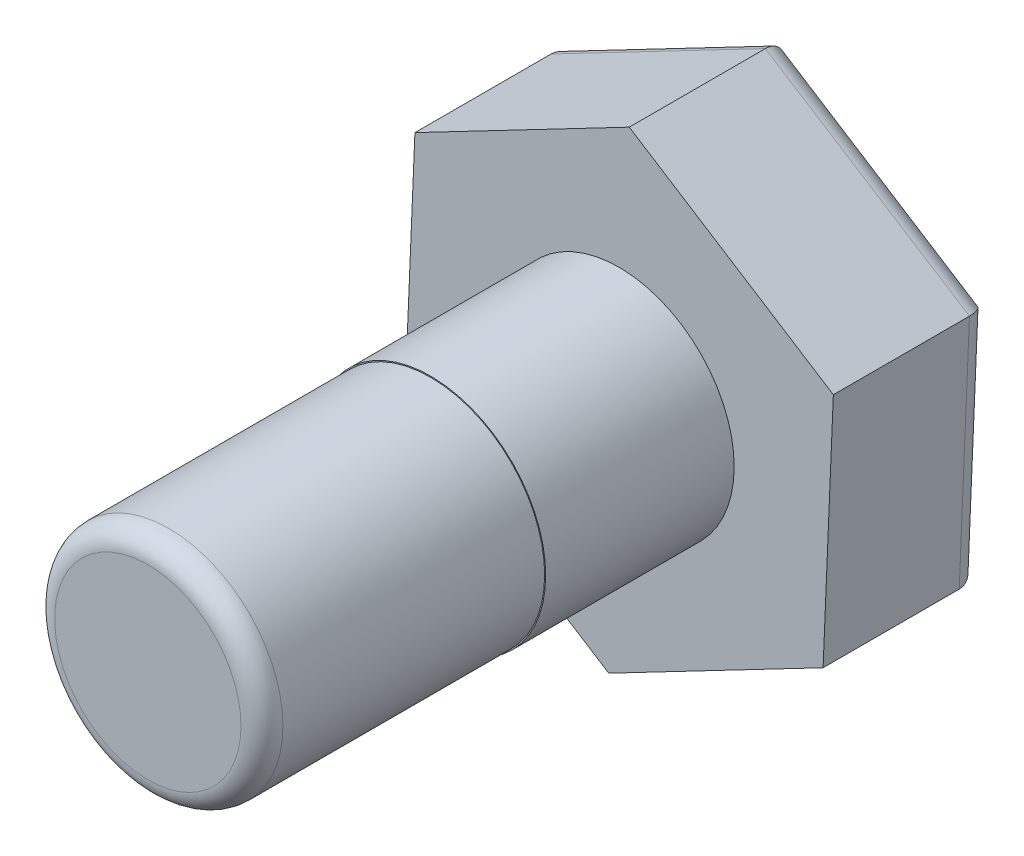
ISO-10303-21;
HEADER;
FILE_DESCRIPTION(('STEP AP214'),'2;1');
FILE_NAME('part.step','',(''),(''),'','','');
FILE_SCHEMA(('AUTOMOTIVE_DESIGN { 1 0 10303 214 1 1 1 1 }'));
ENDSEC;
DATA;
#1=APPLICATION_CONTEXT('core data for automotive mechanical design processes');
#2=APPLICATION_PROTOCOL_DEFINITION('international standard','automotive_design',2000,#1);
#3=PRODUCT_CONTEXT('',#1,'mechanical');
#4=PRODUCT('Part','Part','',(#3));
#5=PRODUCT_RELATED_PRODUCT_CATEGORY('part','',(#4));
#6=PRODUCT_DEFINITION_FORMATION('','',#4);
#7=PRODUCT_DEFINITION_CONTEXT('part definition',#1,'design');
#8=PRODUCT_DEFINITION('design','',#6,#7);
#9=PRODUCT_DEFINITION_SHAPE('','',#8);
#10=(LENGTH_UNIT() NAMED_UNIT(*) SI_UNIT(.MILLI.,.METRE.));
#11=(NAMED_UNIT(*) PLANE_ANGLE_UNIT() SI_UNIT($,.RADIAN.));
#12=(NAMED_UNIT(*) SI_UNIT($,.STERADIAN.) SOLID_ANGLE_UNIT());
#13=UNCERTAINTY_MEASURE_WITH_UNIT(LENGTH_MEASURE(1.E-05),#10,'distance_accuracy_value','');
#14=(GEOMETRIC_REPRESENTATION_CONTEXT(3) GLOBAL_UNCERTAINTY_ASSIGNED_CONTEXT((#13)) GLOBAL_UNIT_ASSIGNED_CONTEXT((#10,
#11,#12)) REPRESENTATION_CONTEXT('',''));
#15=CARTESIAN_POINT('',(0.,0.,0.));
#16=DIRECTION('',(0.,0.,1.));
#17=DIRECTION('',(1.,0.,0.));
#18=AXIS2_PLACEMENT_3D('',#15,#16,#17);
#19=CARTESIAN_POINT('',(0.,0.,33.));
#20=DIRECTION('',(0.,0.,1.));
#21=DIRECTION('',(1.,0.,0.));
#22=AXIS2_PLACEMENT_3D('',#19,#20,#21);
#23=PLANE('',#22);
#24=CARTESIAN_POINT('',(0.,0.,33.));
#25=DIRECTION('',(0.,0.,1.));
#26=DIRECTION('',(1.,0.,0.));
#27=AXIS2_PLACEMENT_3D('',#24,#25,#26);
#28=CIRCLE('',#27,11.);
#29=CARTESIAN_POINT('',(11.,0.,33.));
#30=VERTEX_POINT('',#29);
#31=EDGE_CURVE('E125',#30,#30,#28,.T.);
#32=ORIENTED_EDGE('',*,*,#31,.T.);
#33=EDGE_LOOP('',(#32));
#34=FACE_BOUND('',#33,.T.);
#35=CARTESIAN_POINT('',(0.,0.,33.));
#36=DIRECTION('',(0.,0.,1.));
#37=DIRECTION('',(1.,0.,0.));
#38=AXIS2_PLACEMENT_3D('',#35,#36,#37);
#39=CIRCLE('',#38,10.9);
#40=CARTESIAN_POINT('',(10.9,0.,33.));
#41=VERTEX_POINT('',#40);
#42=EDGE_CURVE('E160',#41,#41,#39,.T.);
#43=ORIENTED_EDGE('',*,*,#42,.F.);
#44=EDGE_LOOP('',(#43));
#45=FACE_BOUND('',#44,.T.);
#46=ADVANCED_FACE('F31',(#34,#45),#23,.T.);
#47=CARTESIAN_POINT('',(21.4532721099387,33.7602890357432,15.));
#48=DIRECTION('',(0.,0.,1.));
#49=DIRECTION('',(1.,0.,0.));
#50=AXIS2_PLACEMENT_3D('',#47,#48,#49);
#51=PLANE('',#50);
#52=DIRECTION('',(0.0424733530908878,0.999097599975707,0.));
#53=VECTOR('',#52,1.);
#54=CARTESIAN_POINT('',(19.4915119627059,-12.3860524276714,15.));
#55=LINE('',#54,#53);
#56=CARTESIAN_POINT('',(19.4915119627059,-12.3860524276714,15.));
#57=VERTEX_POINT('',#56);
#58=CARTESIAN_POINT('',(20.4723920363223,10.6871183040359,15.));
#59=VERTEX_POINT('',#58);
#60=EDGE_CURVE('E117',#57,#59,#55,.T.);
#61=ORIENTED_EDGE('',*,*,#60,.T.);
#62=DIRECTION('',(-0.844007225893581,0.536331802748468,0.));
#63=VECTOR('',#62,1.);
#64=CARTESIAN_POINT('',(20.4723920363223,10.6871183040359,15.));
#65=LINE('',#64,#63);
#66=CARTESIAN_POINT('',(0.980880073616411,23.0731707317073,15.));
#67=VERTEX_POINT('',#66);
#68=EDGE_CURVE('E105',#59,#67,#65,.T.);
#69=ORIENTED_EDGE('',*,*,#68,.T.);
#70=DIRECTION('',(-0.886480578984469,-0.462765797227238,0.));
#71=VECTOR('',#70,1.);
#72=CARTESIAN_POINT('',(0.980880073616411,23.0731707317073,15.));
#73=LINE('',#72,#71);
#74=CARTESIAN_POINT('',(-19.4915119627059,12.3860524276714,15.));
#75=VERTEX_POINT('',#74);
#76=EDGE_CURVE('E116',#67,#75,#73,.T.);
#77=ORIENTED_EDGE('',*,*,#76,.T.);
#78=DIRECTION('',(-0.0424733530908877,-0.999097599975707,0.));
#79=VECTOR('',#78,1.);
#80=CARTESIAN_POINT('',(-19.4915119627059,12.3860524276714,15.));
#81=LINE('',#80,#79);
#82=CARTESIAN_POINT('',(-20.4723920363223,-10.6871183040359,15.));
#83=VERTEX_POINT('',#82);
#84=EDGE_CURVE('E265',#75,#83,#81,.T.);
#85=ORIENTED_EDGE('',*,*,#84,.T.);
#86=DIRECTION('',(0.844007225893581,-0.536331802748469,0.));
#87=VECTOR('',#86,1.);
#88=CARTESIAN_POINT('',(-20.4723920363223,-10.6871183040359,15.));
#89=LINE('',#88,#87);
#90=CARTESIAN_POINT('',(-0.980880073616402,-23.0731707317073,15.));
#91=VERTEX_POINT('',#90);
#92=EDGE_CURVE('E267',#83,#91,#89,.T.);
#93=ORIENTED_EDGE('',*,*,#92,.T.);
#94=DIRECTION('',(0.886480578984469,0.462765797227238,0.));
#95=VECTOR('',#94,1.);
#96=CARTESIAN_POINT('',(-0.980880073616402,-23.0731707317073,15.));
#97=LINE('',#96,#95);
#98=EDGE_CURVE('E123',#91,#57,#97,.T.);
#99=ORIENTED_EDGE('',*,*,#98,.T.);
#100=EDGE_LOOP('',(#61,#69,#77,#85,#93,#99));
#101=FACE_BOUND('',#100,.T.);
#102=CARTESIAN_POINT('',(0.,0.,15.));
#103=DIRECTION('',(0.,0.,1.));
#104=DIRECTION('',(1.,0.,0.));
#105=AXIS2_PLACEMENT_3D('',#102,#103,#104);
#106=CIRCLE('',#105,11.);
#107=CARTESIAN_POINT('',(11.,0.,15.));
#108=VERTEX_POINT('',#107);
#109=EDGE_CURVE('E173',#108,#108,#106,.T.);
#110=ORIENTED_EDGE('',*,*,#109,.F.);
#111=EDGE_LOOP('',(#110));
#112=FACE_BOUND('',#111,.T.);
#113=ADVANCED_FACE('F120',(#101,#112),#51,.T.);
#114=CARTESIAN_POINT('',(19.4915119627059,-12.3860524276714,15.));
#115=DIRECTION('',(-0.999097599975706,0.0424733530908878,0.));
#116=DIRECTION('',(-0.0424733530908878,-0.999097599975706,0.));
#117=AXIS2_PLACEMENT_3D('',#114,#115,#116);
#118=PLANE('',#117);
#119=DIRECTION('',(0.,0.,-1.));
#120=VECTOR('',#119,1.);
#121=CARTESIAN_POINT('',(19.4915119627059,-12.3860524276714,15.));
#122=LINE('',#121,#120);
#123=CARTESIAN_POINT('',(19.4915119627059,-12.3860524276714,2.));
#124=VERTEX_POINT('',#123);
#125=EDGE_CURVE('E272',#57,#124,#122,.T.);
#126=ORIENTED_EDGE('',*,*,#125,.T.);
#127=DIRECTION('',(0.0424733530908878,0.999097599975706,0.));
#128=VECTOR('',#127,1.);
#129=CARTESIAN_POINT('',(19.4915119627059,-12.3860524276714,2.));
#130=LINE('',#129,#128);
#131=CARTESIAN_POINT('',(20.4723920363223,10.6871183040359,2.));
#132=VERTEX_POINT('',#131);
#133=EDGE_CURVE('E129',#124,#132,#130,.T.);
#134=ORIENTED_EDGE('',*,*,#133,.T.);
#135=DIRECTION('',(0.,0.,-1.));
#136=VECTOR('',#135,1.);
#137=CARTESIAN_POINT('',(20.4723920363223,10.6871183040359,15.));
#138=LINE('',#137,#136);
#139=EDGE_CURVE('E110',#59,#132,#138,.T.);
#140=ORIENTED_EDGE('',*,*,#139,.F.);
#141=ORIENTED_EDGE('',*,*,#60,.F.);
#142=EDGE_LOOP('',(#126,#134,#140,#141));
#143=FACE_BOUND('',#142,.T.);
#144=ADVANCED_FACE('F127',(#143),#118,.F.);
#145=CARTESIAN_POINT('',(20.4723920363223,10.6871183040359,15.));
#146=DIRECTION('',(-0.536331802748468,-0.844007225893581,0.));
#147=DIRECTION('',(0.844007225893581,-0.536331802748468,0.));
#148=AXIS2_PLACEMENT_3D('',#145,#146,#147);
#149=PLANE('',#148);
#150=ORIENTED_EDGE('',*,*,#139,.T.);
#151=DIRECTION('',(-0.844007225893581,0.536331802748468,0.));
#152=VECTOR('',#151,1.);
#153=CARTESIAN_POINT('',(20.4723920363223,10.6871183040359,2.));
#154=LINE('',#153,#152);
#155=CARTESIAN_POINT('',(0.980880073616411,23.0731707317073,2.));
#156=VERTEX_POINT('',#155);
#157=EDGE_CURVE('E130',#132,#156,#154,.T.);
#158=ORIENTED_EDGE('',*,*,#157,.T.);
#159=DIRECTION('',(0.,0.,-1.));
#160=VECTOR('',#159,1.);
#161=CARTESIAN_POINT('',(0.980880073616411,23.0731707317073,15.));
#162=LINE('',#161,#160);
#163=EDGE_CURVE('E113',#67,#156,#162,.T.);
#164=ORIENTED_EDGE('',*,*,#163,.F.);
#165=ORIENTED_EDGE('',*,*,#68,.F.);
#166=EDGE_LOOP('',(#150,#158,#164,#165));
#167=FACE_BOUND('',#166,.T.);
#168=ADVANCED_FACE('F107',(#167),#149,.F.);
#169=CARTESIAN_POINT('',(0.980880073616411,23.0731707317073,15.));
#170=DIRECTION('',(0.462765797227238,-0.886480578984469,0.));
#171=DIRECTION('',(0.886480578984469,0.462765797227238,0.));
#172=AXIS2_PLACEMENT_3D('',#169,#170,#171);
#173=PLANE('',#172);
#174=ORIENTED_EDGE('',*,*,#163,.T.);
#175=DIRECTION('',(-0.886480578984469,-0.462765797227238,0.));
#176=VECTOR('',#175,1.);
#177=CARTESIAN_POINT('',(0.980880073616411,23.0731707317073,2.));
#178=LINE('',#177,#176);
#179=CARTESIAN_POINT('',(-19.4915119627059,12.3860524276714,2.));
#180=VERTEX_POINT('',#179);
#181=EDGE_CURVE('E150',#156,#180,#178,.T.);
#182=ORIENTED_EDGE('',*,*,#181,.T.);
#183=DIRECTION('',(0.,0.,-1.));
#184=VECTOR('',#183,1.);
#185=CARTESIAN_POINT('',(-19.4915119627059,12.3860524276714,15.));
#186=LINE('',#185,#184);
#187=EDGE_CURVE('E134',#75,#180,#186,.T.);
#188=ORIENTED_EDGE('',*,*,#187,.F.);
#189=ORIENTED_EDGE('',*,*,#76,.F.);
#190=EDGE_LOOP('',(#174,#182,#188,#189));
#191=FACE_BOUND('',#190,.T.);
#192=ADVANCED_FACE('F216',(#191),#173,.F.);
#193=CARTESIAN_POINT('',(-19.4915119627059,12.3860524276714,15.));
#194=DIRECTION('',(0.999097599975706,-0.0424733530908877,0.));
#195=DIRECTION('',(0.0424733530908877,0.999097599975706,0.));
#196=AXIS2_PLACEMENT_3D('',#193,#194,#195);
#197=PLANE('',#196);
#198=ORIENTED_EDGE('',*,*,#187,.T.);
#199=DIRECTION('',(-0.0424733530908877,-0.999097599975706,0.));
#200=VECTOR('',#199,1.);
#201=CARTESIAN_POINT('',(-19.4915119627059,12.3860524276714,2.));
#202=LINE('',#201,#200);
#203=CARTESIAN_POINT('',(-20.4723920363223,-10.6871183040359,2.));
#204=VERTEX_POINT('',#203);
#205=EDGE_CURVE('E152',#180,#204,#202,.T.);
#206=ORIENTED_EDGE('',*,*,#205,.T.);
#207=DIRECTION('',(0.,0.,-1.));
#208=VECTOR('',#207,1.);
#209=CARTESIAN_POINT('',(-20.4723920363223,-10.6871183040359,15.));
#210=LINE('',#209,#208);
#211=EDGE_CURVE('E276',#83,#204,#210,.T.);
#212=ORIENTED_EDGE('',*,*,#211,.F.);
#213=ORIENTED_EDGE('',*,*,#84,.F.);
#214=EDGE_LOOP('',(#198,#206,#212,#213));
#215=FACE_BOUND('',#214,.T.);
#216=ADVANCED_FACE('F213',(#215),#197,.F.);
#217=CARTESIAN_POINT('',(-20.4723920363223,-10.6871183040359,15.));
#218=DIRECTION('',(0.536331802748468,0.844007225893581,0.));
#219=DIRECTION('',(-0.844007225893581,0.536331802748468,0.));
#220=AXIS2_PLACEMENT_3D('',#217,#218,#219);
#221=PLANE('',#220);
#222=ORIENTED_EDGE('',*,*,#211,.T.);
#223=DIRECTION('',(0.844007225893581,-0.536331802748468,0.));
#224=VECTOR('',#223,1.);
#225=CARTESIAN_POINT('',(-20.4723920363223,-10.6871183040359,2.));
#226=LINE('',#225,#224);
#227=CARTESIAN_POINT('',(-0.980880073616402,-23.0731707317073,2.));
#228=VERTEX_POINT('',#227);
#229=EDGE_CURVE('E54',#204,#228,#226,.T.);
#230=ORIENTED_EDGE('',*,*,#229,.T.);
#231=DIRECTION('',(0.,0.,-1.));
#232=VECTOR('',#231,1.);
#233=CARTESIAN_POINT('',(-0.980880073616402,-23.0731707317073,15.));
#234=LINE('',#233,#232);
#235=EDGE_CURVE('E274',#91,#228,#234,.T.);
#236=ORIENTED_EDGE('',*,*,#235,.F.);
#237=ORIENTED_EDGE('',*,*,#92,.F.);
#238=EDGE_LOOP('',(#222,#230,#236,#237));
#239=FACE_BOUND('',#238,.T.);
#240=ADVANCED_FACE('F210',(#239),#221,.F.);
#241=CARTESIAN_POINT('',(-0.980880073616402,-23.0731707317073,15.));
#242=DIRECTION('',(-0.462765797227238,0.886480578984469,0.));
#243=DIRECTION('',(-0.886480578984469,-0.462765797227238,0.));
#244=AXIS2_PLACEMENT_3D('',#241,#242,#243);
#245=PLANE('',#244);
#246=ORIENTED_EDGE('',*,*,#235,.T.);
#247=DIRECTION('',(0.886480578984469,0.462765797227238,0.));
#248=VECTOR('',#247,1.);
#249=CARTESIAN_POINT('',(-0.980880073616402,-23.0731707317073,2.));
#250=LINE('',#249,#248);
#251=EDGE_CURVE('E46',#228,#124,#250,.T.);
#252=ORIENTED_EDGE('',*,*,#251,.T.);
#253=ORIENTED_EDGE('',*,*,#125,.F.);
#254=ORIENTED_EDGE('',*,*,#98,.F.);
#255=EDGE_LOOP('',(#246,#252,#253,#254));
#256=FACE_BOUND('',#255,.T.);
#257=ADVANCED_FACE('F206',(#256),#245,.F.);
#258=CARTESIAN_POINT('',(21.4532721099387,33.7602890357432,0.));
#259=DIRECTION('',(0.,0.,1.));
#260=DIRECTION('',(1.,0.,0.));
#261=AXIS2_PLACEMENT_3D('',#258,#259,#260);
#262=PLANE('',#261);
#263=DIRECTION('',(-0.886480578984469,-0.462765797227238,0.));
#264=VECTOR('',#263,1.);
#265=CARTESIAN_POINT('',(22.3788037043932,31.9873278777743,0.));
#266=LINE('',#265,#264);
#267=CARTESIAN_POINT('',(-17.5423607664353,11.1474471849043,0.));
#268=VERTEX_POINT('',#267);
#269=CARTESIAN_POINT('',(0.882792066254768,20.7658536585366,0.));
#270=VERTEX_POINT('',#269);
#271=EDGE_CURVE('E145',#268,#270,#266,.F.);
#272=ORIENTED_EDGE('',*,*,#271,.T.);
#273=DIRECTION('',(-0.844007225893581,0.536331802748468,0.));
#274=VECTOR('',#273,1.);
#275=CARTESIAN_POINT('',(9.65397244947244,15.1921300660844,0.));
#276=LINE('',#275,#274);
#277=CARTESIAN_POINT('',(18.4251528326901,9.61840647363232,0.));
#278=VERTEX_POINT('',#277);
#279=EDGE_CURVE('E147',#270,#278,#276,.F.);
#280=ORIENTED_EDGE('',*,*,#279,.T.);
#281=DIRECTION('',(0.0424733530908878,0.999097599975706,0.));
#282=VECTOR('',#281,1.);
#283=CARTESIAN_POINT('',(19.4550769099873,33.845235741925,0.));
#284=LINE('',#283,#282);
#285=CARTESIAN_POINT('',(17.5423607664353,-11.1474471849043,0.));
#286=VERTEX_POINT('',#285);
#287=EDGE_CURVE('E132',#278,#286,#284,.F.);
#288=ORIENTED_EDGE('',*,*,#287,.T.);
#289=DIRECTION('',(0.886480578984469,0.462765797227238,0.));
#290=VECTOR('',#289,1.);
#291=CARTESIAN_POINT('',(39.0383724045738,0.0740270343334015,0.));
#292=LINE('',#291,#290);
#293=CARTESIAN_POINT('',(-0.882792066254761,-20.7658536585366,0.));
#294=VERTEX_POINT('',#293);
#295=EDGE_CURVE('E139',#286,#294,#292,.F.);
#296=ORIENTED_EDGE('',*,*,#295,.T.);
#297=DIRECTION('',(0.844007225893581,-0.536331802748468,0.));
#298=VECTOR('',#297,1.);
#299=CARTESIAN_POINT('',(-9.65397244947243,-15.1921300660844,0.));
#300=LINE('',#299,#298);
#301=CARTESIAN_POINT('',(-18.4251528326901,-9.61840647363232,0.));
#302=VERTEX_POINT('',#301);
#303=EDGE_CURVE('E141',#294,#302,#300,.F.);
#304=ORIENTED_EDGE('',*,*,#303,.T.);
#305=DIRECTION('',(-0.0424733530908877,-0.999097599975706,0.));
#306=VECTOR('',#305,1.);
#307=CARTESIAN_POINT('',(-16.5124366891381,35.374276453197,0.));
#308=LINE('',#307,#306);
#309=EDGE_CURVE('E143',#302,#268,#308,.F.);
#310=ORIENTED_EDGE('',*,*,#309,.T.);
#311=EDGE_LOOP('',(#272,#280,#288,#296,#304,#310));
#312=FACE_BOUND('',#311,.T.);
#313=ADVANCED_FACE('F201',(#312),#262,.F.);
#314=CARTESIAN_POINT('',(0.,0.,33.));
#315=DIRECTION('',(0.,0.,-1.));
#316=DIRECTION('',(-1.,0.,0.));
#317=AXIS2_PLACEMENT_3D('',#314,#315,#316);
#318=CYLINDRICAL_SURFACE('',#317,11.);
#319=ORIENTED_EDGE('',*,*,#31,.F.);
#320=EDGE_LOOP('',(#319));
#321=FACE_BOUND('',#320,.T.);
#322=ORIENTED_EDGE('',*,*,#109,.T.);
#323=EDGE_LOOP('',(#322));
#324=FACE_BOUND('',#323,.T.);
#325=ADVANCED_FACE('F198',(#321,#324),#318,.T.);
#326=CARTESIAN_POINT('',(-19.3997284308254,-8.99910385224874,2.));
#327=DIRECTION('',(0.844007225893581,-0.536331802748468,0.));
#328=DIRECTION('',(0.536331802748468,0.844007225893581,0.));
#329=AXIS2_PLACEMENT_3D('',#326,#327,#328);
#330=CYLINDRICAL_SURFACE('',#329,2.);
#331=CARTESIAN_POINT('',(-18.4251528326901,-9.61840647363232,2.));
#332=DIRECTION('',(0.462765797227238,-0.886480578984469,0.));
#333=DIRECTION('',(0.886480578984469,0.462765797227238,0.));
#334=AXIS2_PLACEMENT_3D('',#331,#332,#333);
#335=ELLIPSE('',#334,2.3094010767585,2.);
#336=EDGE_CURVE('E168',#302,#204,#335,.F.);
#337=ORIENTED_EDGE('',*,*,#336,.F.);
#338=ORIENTED_EDGE('',*,*,#303,.F.);
#339=CARTESIAN_POINT('',(-0.882792066254761,-20.7658536585366,2.));
#340=DIRECTION('',(0.999097599975706,-0.042473353090888,0.));
#341=DIRECTION('',(0.042473353090888,0.999097599975707,0.));
#342=AXIS2_PLACEMENT_3D('',#339,#340,#341);
#343=ELLIPSE('',#342,2.3094010767585,2.);
#344=EDGE_CURVE('E171',#228,#294,#343,.T.);
#345=ORIENTED_EDGE('',*,*,#344,.F.);
#346=ORIENTED_EDGE('',*,*,#229,.F.);
#347=EDGE_LOOP('',(#337,#338,#345,#346));
#348=FACE_BOUND('',#347,.T.);
#349=ADVANCED_FACE('F200',(#348),#330,.T.);
#350=CARTESIAN_POINT('',(-1.90641166807088,-21.3002095737384,2.));
#351=DIRECTION('',(0.886480578984469,0.462765797227238,0.));
#352=DIRECTION('',(-0.462765797227238,0.886480578984469,0.));
#353=AXIS2_PLACEMENT_3D('',#350,#351,#352);
#354=CYLINDRICAL_SURFACE('',#353,2.);
#355=ORIENTED_EDGE('',*,*,#344,.T.);
#356=ORIENTED_EDGE('',*,*,#295,.F.);
#357=CARTESIAN_POINT('',(17.5423607664353,-11.1474471849043,2.));
#358=DIRECTION('',(0.536331802748468,0.844007225893581,0.));
#359=DIRECTION('',(-0.844007225893581,0.536331802748469,0.));
#360=AXIS2_PLACEMENT_3D('',#357,#358,#359);
#361=ELLIPSE('',#360,2.3094010767585,2.);
#362=EDGE_CURVE('E165',#124,#286,#361,.T.);
#363=ORIENTED_EDGE('',*,*,#362,.F.);
#364=ORIENTED_EDGE('',*,*,#251,.F.);
#365=EDGE_LOOP('',(#355,#356,#363,#364));
#366=FACE_BOUND('',#365,.T.);
#367=ADVANCED_FACE('F240',(#366),#354,.T.);
#368=CARTESIAN_POINT('',(-17.4933167627545,12.3011057214896,2.));
#369=DIRECTION('',(-0.0424733530908877,-0.999097599975706,0.));
#370=DIRECTION('',(0.999097599975706,-0.0424733530908877,0.));
#371=AXIS2_PLACEMENT_3D('',#368,#369,#370);
#372=CYLINDRICAL_SURFACE('',#371,2.);
#373=ORIENTED_EDGE('',*,*,#336,.T.);
#374=ORIENTED_EDGE('',*,*,#205,.F.);
#375=CARTESIAN_POINT('',(-17.5423607664353,11.1474471849043,2.));
#376=DIRECTION('',(-0.536331802748468,-0.844007225893581,0.));
#377=DIRECTION('',(0.844007225893581,-0.536331802748468,0.));
#378=AXIS2_PLACEMENT_3D('',#375,#376,#377);
#379=ELLIPSE('',#378,2.3094010767585,2.);
#380=EDGE_CURVE('E162',#268,#180,#379,.F.);
#381=ORIENTED_EDGE('',*,*,#380,.F.);
#382=ORIENTED_EDGE('',*,*,#309,.F.);
#383=EDGE_LOOP('',(#373,#374,#381,#382));
#384=FACE_BOUND('',#383,.T.);
#385=ADVANCED_FACE('F236',(#384),#372,.T.);
#386=CARTESIAN_POINT('',(17.4933167627545,-12.3011057214897,2.));
#387=DIRECTION('',(0.0424733530908878,0.999097599975706,0.));
#388=DIRECTION('',(-0.999097599975706,0.0424733530908878,0.));
#389=AXIS2_PLACEMENT_3D('',#386,#387,#388);
#390=CYLINDRICAL_SURFACE('',#389,2.);
#391=ORIENTED_EDGE('',*,*,#362,.T.);
#392=ORIENTED_EDGE('',*,*,#287,.F.);
#393=CARTESIAN_POINT('',(18.4251528326901,9.61840647363231,2.));
#394=DIRECTION('',(-0.462765797227238,0.886480578984469,0.));
#395=DIRECTION('',(0.886480578984469,0.462765797227238,0.));
#396=AXIS2_PLACEMENT_3D('',#393,#394,#395);
#397=ELLIPSE('',#396,2.3094010767585,2.);
#398=EDGE_CURVE('E159',#132,#278,#397,.T.);
#399=ORIENTED_EDGE('',*,*,#398,.F.);
#400=ORIENTED_EDGE('',*,*,#133,.F.);
#401=EDGE_LOOP('',(#391,#392,#399,#400));
#402=FACE_BOUND('',#401,.T.);
#403=ADVANCED_FACE('F232',(#402),#390,.T.);
#404=CARTESIAN_POINT('',(1.90641166807089,21.3002095737384,2.));
#405=DIRECTION('',(-0.886480578984469,-0.462765797227238,0.));
#406=DIRECTION('',(0.462765797227238,-0.886480578984469,0.));
#407=AXIS2_PLACEMENT_3D('',#404,#405,#406);
#408=CYLINDRICAL_SURFACE('',#407,2.);
#409=ORIENTED_EDGE('',*,*,#380,.T.);
#410=ORIENTED_EDGE('',*,*,#181,.F.);
#411=CARTESIAN_POINT('',(0.882792066254761,20.7658536585366,2.));
#412=DIRECTION('',(-0.999097599975706,0.042473353090888,0.));
#413=DIRECTION('',(-0.0424733530908879,-0.999097599975706,0.));
#414=AXIS2_PLACEMENT_3D('',#411,#412,#413);
#415=ELLIPSE('',#414,2.3094010767585,2.);
#416=EDGE_CURVE('E157',#270,#156,#415,.F.);
#417=ORIENTED_EDGE('',*,*,#416,.F.);
#418=ORIENTED_EDGE('',*,*,#271,.F.);
#419=EDGE_LOOP('',(#409,#410,#417,#418));
#420=FACE_BOUND('',#419,.T.);
#421=ADVANCED_FACE('F228',(#420),#408,.T.);
#422=CARTESIAN_POINT('',(19.3997284308254,8.99910385224875,2.));
#423=DIRECTION('',(-0.844007225893581,0.536331802748468,0.));
#424=DIRECTION('',(-0.536331802748468,-0.844007225893581,0.));
#425=AXIS2_PLACEMENT_3D('',#422,#423,#424);
#426=CYLINDRICAL_SURFACE('',#425,2.);
#427=ORIENTED_EDGE('',*,*,#398,.T.);
#428=ORIENTED_EDGE('',*,*,#279,.F.);
#429=ORIENTED_EDGE('',*,*,#416,.T.);
#430=ORIENTED_EDGE('',*,*,#157,.F.);
#431=EDGE_LOOP('',(#427,#428,#429,#430));
#432=FACE_BOUND('',#431,.T.);
#433=ADVANCED_FACE('F225',(#432),#426,.T.);
#434=CARTESIAN_POINT('',(0.,0.,60.));
#435=DIRECTION('',(0.,0.,-1.));
#436=DIRECTION('',(-1.,0.,0.));
#437=AXIS2_PLACEMENT_3D('',#434,#435,#436);
#438=CYLINDRICAL_SURFACE('',#437,10.9);
#439=CARTESIAN_POINT('',(0.,0.,58.));
#440=DIRECTION('',(0.,0.,1.));
#441=DIRECTION('',(1.,0.,0.));
#442=AXIS2_PLACEMENT_3D('',#439,#440,#441);
#443=CIRCLE('',#442,10.9);
#444=CARTESIAN_POINT('',(10.9,0.,58.));
#445=VERTEX_POINT('',#444);
#446=EDGE_CURVE('E11',#445,#445,#443,.F.);
#447=ORIENTED_EDGE('',*,*,#446,.T.);
#448=EDGE_LOOP('',(#447));
#449=FACE_BOUND('',#448,.T.);
#450=ORIENTED_EDGE('',*,*,#42,.T.);
#451=EDGE_LOOP('',(#450));
#452=FACE_BOUND('',#451,.T.);
#453=ADVANCED_FACE('F184',(#449,#452),#438,.T.);
#454=CARTESIAN_POINT('',(0.,0.,60.));
#455=DIRECTION('',(0.,0.,1.));
#456=DIRECTION('',(1.,0.,0.));
#457=AXIS2_PLACEMENT_3D('',#454,#455,#456);
#458=PLANE('',#457);
#459=CARTESIAN_POINT('',(0.,0.,60.));
#460=DIRECTION('',(0.,0.,1.));
#461=DIRECTION('',(1.,0.,0.));
#462=AXIS2_PLACEMENT_3D('',#459,#460,#461);
#463=CIRCLE('',#462,8.9);
#464=CARTESIAN_POINT('',(8.9,0.,60.));
#465=VERTEX_POINT('',#464);
#466=EDGE_CURVE('E39',#465,#465,#463,.T.);
#467=ORIENTED_EDGE('',*,*,#466,.T.);
#468=EDGE_LOOP('',(#467));
#469=FACE_BOUND('',#468,.T.);
#470=ADVANCED_FACE('F177',(#469),#458,.T.);
#471=CARTESIAN_POINT('',(0.,0.,58.));
#472=DIRECTION('',(0.,0.,1.));
#473=DIRECTION('',(1.,0.,0.));
#474=AXIS2_PLACEMENT_3D('',#471,#472,#473);
#475=TOROIDAL_SURFACE('',#474,8.9,2.);
#476=ORIENTED_EDGE('',*,*,#446,.F.);
#477=EDGE_LOOP('',(#476));
#478=FACE_BOUND('',#477,.T.);
#479=ORIENTED_EDGE('',*,*,#466,.F.);
#480=EDGE_LOOP('',(#479));
#481=FACE_BOUND('',#480,.T.);
#482=ADVANCED_FACE('F33',(#478,#481),#475,.T.);
#483=CLOSED_SHELL('',(#46,#113,#144,#168,#192,#216,#240,#257,#313,#325,#349,#367,#385,#403,#421,
#433,#453,#470,#482));
#484=MANIFOLD_SOLID_BREP('B2',#483);
#485=ADVANCED_BREP_SHAPE_REPRESENTATION('',(#18,#484),#14);
#486=SHAPE_DEFINITION_REPRESENTATION(#9,#485);
ENDSEC;
END-ISO-10303-21;
